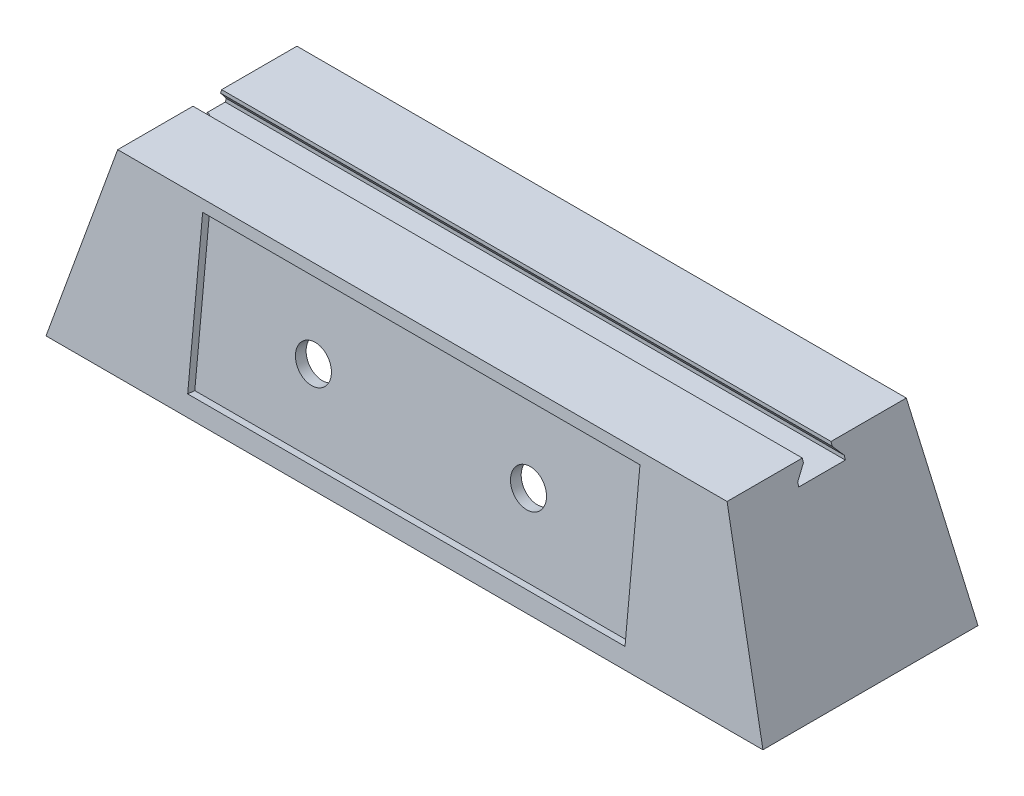
ISO-10303-21;
HEADER;
FILE_DESCRIPTION(('STEP AP214'),'2;1');
FILE_NAME('part.step','',(''),(''),'','','');
FILE_SCHEMA(('AUTOMOTIVE_DESIGN { 1 0 10303 214 1 1 1 1 }'));
ENDSEC;
DATA;
#1=APPLICATION_CONTEXT('core data for automotive mechanical design processes');
#2=APPLICATION_PROTOCOL_DEFINITION('international standard','automotive_design',2000,#1);
#3=PRODUCT_CONTEXT('',#1,'mechanical');
#4=PRODUCT('Part','Part','',(#3));
#5=PRODUCT_RELATED_PRODUCT_CATEGORY('part','',(#4));
#6=PRODUCT_DEFINITION_FORMATION('','',#4);
#7=PRODUCT_DEFINITION_CONTEXT('part definition',#1,'design');
#8=PRODUCT_DEFINITION('design','',#6,#7);
#9=PRODUCT_DEFINITION_SHAPE('','',#8);
#10=(LENGTH_UNIT() NAMED_UNIT(*) SI_UNIT(.MILLI.,.METRE.));
#11=(NAMED_UNIT(*) PLANE_ANGLE_UNIT() SI_UNIT($,.RADIAN.));
#12=(NAMED_UNIT(*) SI_UNIT($,.STERADIAN.) SOLID_ANGLE_UNIT());
#13=UNCERTAINTY_MEASURE_WITH_UNIT(LENGTH_MEASURE(1.E-05),#10,'distance_accuracy_value','');
#14=(GEOMETRIC_REPRESENTATION_CONTEXT(3) GLOBAL_UNCERTAINTY_ASSIGNED_CONTEXT((#13)) GLOBAL_UNIT_ASSIGNED_CONTEXT((#10,
#11,#12)) REPRESENTATION_CONTEXT('',''));
#15=CARTESIAN_POINT('',(0.,0.,0.));
#16=DIRECTION('',(0.,0.,1.));
#17=DIRECTION('',(1.,0.,0.));
#18=AXIS2_PLACEMENT_3D('',#15,#16,#17);
#19=CARTESIAN_POINT('',(-100.000000000004,0.,30.000000000001));
#20=DIRECTION('',(0.,0.0995037190210191,0.995037190209987));
#21=DIRECTION('',(1.,0.,0.));
#22=AXIS2_PLACEMENT_3D('',#19,#20,#21);
#23=PLANE('',#22);
#24=DIRECTION('',(1.,0.,0.));
#25=VECTOR('',#24,1.);
#26=CARTESIAN_POINT('',(-80.5000000000021,47.01488842937,25.298511157063));
#27=LINE('',#26,#25);
#28=CARTESIAN_POINT('',(-61.,47.01488842937,25.298511157063));
#29=VERTEX_POINT('',#28);
#30=CARTESIAN_POINT('',(61.,47.01488842937,25.298511157063));
#31=VERTEX_POINT('',#30);
#32=EDGE_CURVE('E412',#29,#31,#27,.T.);
#33=ORIENTED_EDGE('',*,*,#32,.T.);
#34=DIRECTION('',(0.,-0.995037190209987,0.0995037190210191));
#35=VECTOR('',#34,1.);
#36=CARTESIAN_POINT('',(61.,23.507444214685,27.649255578532));
#37=LINE('',#36,#35);
#38=CARTESIAN_POINT('',(61.,5.22332644055057,29.4776673559458));
#39=VERTEX_POINT('',#38);
#40=EDGE_CURVE('E357',#31,#39,#37,.T.);
#41=ORIENTED_EDGE('',*,*,#40,.T.);
#42=DIRECTION('',(-1.,0.,0.));
#43=VECTOR('',#42,1.);
#44=CARTESIAN_POINT('',(-19.5000000000021,5.22332644055057,29.4776673559459));
#45=LINE('',#44,#43);
#46=CARTESIAN_POINT('',(-61.,5.22332644055057,29.4776673559458));
#47=VERTEX_POINT('',#46);
#48=EDGE_CURVE('E440',#39,#47,#45,.T.);
#49=ORIENTED_EDGE('',*,*,#48,.T.);
#50=DIRECTION('',(0.,0.995037190209987,-0.0995037190210191));
#51=VECTOR('',#50,1.);
#52=CARTESIAN_POINT('',(-61.,2.61166322027529,29.7388336779734));
#53=LINE('',#52,#51);
#54=EDGE_CURVE('E430',#47,#29,#53,.T.);
#55=ORIENTED_EDGE('',*,*,#54,.T.);
#56=EDGE_LOOP('',(#33,#41,#49,#55));
#57=FACE_BOUND('',#56,.T.);
#58=DIRECTION('',(1.,0.,0.));
#59=VECTOR('',#58,1.);
#60=CARTESIAN_POINT('',(-100.000000000004,0.,30.000000000001));
#61=LINE('',#60,#59);
#62=CARTESIAN_POINT('',(-100.000000000004,0.,30.000000000001));
#63=VERTEX_POINT('',#62);
#64=CARTESIAN_POINT('',(99.9999999999959,0.,30.000000000001));
#65=VERTEX_POINT('',#64);
#66=EDGE_CURVE('E25',#63,#65,#61,.T.);
#67=ORIENTED_EDGE('',*,*,#66,.T.);
#68=DIRECTION('',(-0.286038776773604,0.953462589245612,-0.0953462589245808));
#69=VECTOR('',#68,1.);
#70=CARTESIAN_POINT('',(99.9999999999959,0.,30.000000000001));
#71=LINE('',#70,#69);
#72=CARTESIAN_POINT('',(85.,50.,25.));
#73=VERTEX_POINT('',#72);
#74=EDGE_CURVE('E271',#65,#73,#71,.T.);
#75=ORIENTED_EDGE('',*,*,#74,.T.);
#76=DIRECTION('',(1.,0.,0.));
#77=VECTOR('',#76,1.);
#78=CARTESIAN_POINT('',(-85.,50.,25.));
#79=LINE('',#78,#77);
#80=CARTESIAN_POINT('',(-85.,50.,25.));
#81=VERTEX_POINT('',#80);
#82=EDGE_CURVE('E264',#81,#73,#79,.T.);
#83=ORIENTED_EDGE('',*,*,#82,.F.);
#84=DIRECTION('',(0.286038776773751,0.953462589245569,-0.095346258924576));
#85=VECTOR('',#84,1.);
#86=CARTESIAN_POINT('',(-100.000000000004,0.,30.000000000001));
#87=LINE('',#86,#85);
#88=EDGE_CURVE('E724',#63,#81,#87,.T.);
#89=ORIENTED_EDGE('',*,*,#88,.F.);
#90=EDGE_LOOP('',(#67,#75,#83,#89));
#91=FACE_BOUND('',#90,.T.);
#92=ADVANCED_FACE('F16',(#57,#91),#23,.T.);
#93=CARTESIAN_POINT('',(99.9999999999958,0.,-29.999999999999));
#94=DIRECTION('',(0.,0.0995037190209786,-0.995037190209991));
#95=DIRECTION('',(-1.,0.,0.));
#96=AXIS2_PLACEMENT_3D('',#93,#94,#95);
#97=PLANE('',#96);
#98=DIRECTION('',(-1.,0.,0.));
#99=VECTOR('',#98,1.);
#100=CARTESIAN_POINT('',(99.9999999999958,0.,-29.999999999999));
#101=LINE('',#100,#99);
#102=CARTESIAN_POINT('',(99.9999999999958,0.,-29.999999999999));
#103=VERTEX_POINT('',#102);
#104=CARTESIAN_POINT('',(-100.000000000004,0.,-29.999999999999));
#105=VERTEX_POINT('',#104);
#106=EDGE_CURVE('E10',#103,#105,#101,.T.);
#107=ORIENTED_EDGE('',*,*,#106,.T.);
#108=DIRECTION('',(0.286038776773752,0.953462589245572,0.0953462589245374));
#109=VECTOR('',#108,1.);
#110=CARTESIAN_POINT('',(-100.000000000004,0.,-29.999999999999));
#111=LINE('',#110,#109);
#112=CARTESIAN_POINT('',(-85.,50.,-25.));
#113=VERTEX_POINT('',#112);
#114=EDGE_CURVE('E706',#105,#113,#111,.T.);
#115=ORIENTED_EDGE('',*,*,#114,.T.);
#116=DIRECTION('',(-1.,0.,0.));
#117=VECTOR('',#116,1.);
#118=CARTESIAN_POINT('',(85.,50.,-25.));
#119=LINE('',#118,#117);
#120=CARTESIAN_POINT('',(85.,50.,-25.));
#121=VERTEX_POINT('',#120);
#122=EDGE_CURVE('E40',#121,#113,#119,.T.);
#123=ORIENTED_EDGE('',*,*,#122,.F.);
#124=DIRECTION('',(-0.286038776773605,0.953462589245616,0.095346258924542));
#125=VECTOR('',#124,1.);
#126=CARTESIAN_POINT('',(99.9999999999958,0.,-29.999999999999));
#127=LINE('',#126,#125);
#128=EDGE_CURVE('E318',#103,#121,#127,.T.);
#129=ORIENTED_EDGE('',*,*,#128,.F.);
#130=EDGE_LOOP('',(#107,#115,#123,#129));
#131=FACE_BOUND('',#130,.T.);
#132=ADVANCED_FACE('F18',(#131),#97,.T.);
#133=CARTESIAN_POINT('',(-4.19182947871059E-12,0.,1.02806652080289E-12));
#134=DIRECTION('',(0.,1.,0.));
#135=DIRECTION('',(1.,0.,0.));
#136=AXIS2_PLACEMENT_3D('',#133,#134,#135);
#137=PLANE('',#136);
#138=DIRECTION('',(0.,0.,1.));
#139=VECTOR('',#138,1.);
#140=CARTESIAN_POINT('',(-96.867908047331,0.,-14.999999999999));
#141=LINE('',#140,#139);
#142=CARTESIAN_POINT('',(-96.8679080473309,0.,-26.9850373136627));
#143=VERTEX_POINT('',#142);
#144=CARTESIAN_POINT('',(-96.867908047331,0.,26.9850373136647));
#145=VERTEX_POINT('',#144);
#146=EDGE_CURVE('E399',#143,#145,#141,.T.);
#147=ORIENTED_EDGE('',*,*,#146,.T.);
#148=DIRECTION('',(1.,0.,0.));
#149=VECTOR('',#148,1.);
#150=CARTESIAN_POINT('',(-50.0000000000042,0.,26.9850373136647));
#151=LINE('',#150,#149);
#152=CARTESIAN_POINT('',(96.8679080473228,0.,26.9850373136647));
#153=VERTEX_POINT('',#152);
#154=EDGE_CURVE('E411',#145,#153,#151,.T.);
#155=ORIENTED_EDGE('',*,*,#154,.T.);
#156=DIRECTION('',(0.,0.,-1.));
#157=VECTOR('',#156,1.);
#158=CARTESIAN_POINT('',(96.8679080473228,0.,15.000000000001));
#159=LINE('',#158,#157);
#160=CARTESIAN_POINT('',(96.8679080473227,0.,-26.9850373136627));
#161=VERTEX_POINT('',#160);
#162=EDGE_CURVE('E383',#153,#161,#159,.T.);
#163=ORIENTED_EDGE('',*,*,#162,.T.);
#164=DIRECTION('',(-1.,0.,0.));
#165=VECTOR('',#164,1.);
#166=CARTESIAN_POINT('',(49.9999999999958,0.,-26.9850373136627));
#167=LINE('',#166,#165);
#168=EDGE_CURVE('E410',#161,#143,#167,.T.);
#169=ORIENTED_EDGE('',*,*,#168,.T.);
#170=EDGE_LOOP('',(#147,#155,#163,#169));
#171=FACE_BOUND('',#170,.T.);
#172=DIRECTION('',(0.,0.,-1.));
#173=VECTOR('',#172,1.);
#174=CARTESIAN_POINT('',(99.9999999999959,0.,30.000000000001));
#175=LINE('',#174,#173);
#176=EDGE_CURVE('E320',#65,#103,#175,.T.);
#177=ORIENTED_EDGE('',*,*,#176,.F.);
#178=ORIENTED_EDGE('',*,*,#66,.F.);
#179=DIRECTION('',(0.,0.,1.));
#180=VECTOR('',#179,1.);
#181=CARTESIAN_POINT('',(-100.000000000004,0.,-29.999999999999));
#182=LINE('',#181,#180);
#183=EDGE_CURVE('E709',#105,#63,#182,.T.);
#184=ORIENTED_EDGE('',*,*,#183,.F.);
#185=ORIENTED_EDGE('',*,*,#106,.F.);
#186=EDGE_LOOP('',(#177,#178,#184,#185));
#187=FACE_BOUND('',#186,.T.);
#188=ADVANCED_FACE('F885',(#171,#187),#137,.F.);
#189=CARTESIAN_POINT('',(0.,50.,0.));
#190=DIRECTION('',(0.,1.,0.));
#191=DIRECTION('',(1.,0.,0.));
#192=AXIS2_PLACEMENT_3D('',#189,#190,#191);
#193=PLANE('',#192);
#194=DIRECTION('',(1.,0.,0.));
#195=VECTOR('',#194,1.);
#196=CARTESIAN_POINT('',(0.,50.,-4.));
#197=LINE('',#196,#195);
#198=CARTESIAN_POINT('',(-85.,50.,-4.));
#199=VERTEX_POINT('',#198);
#200=CARTESIAN_POINT('',(85.,50.,-4.));
#201=VERTEX_POINT('',#200);
#202=EDGE_CURVE('E299',#199,#201,#197,.T.);
#203=ORIENTED_EDGE('',*,*,#202,.T.);
#204=DIRECTION('',(0.,0.,-1.));
#205=VECTOR('',#204,1.);
#206=CARTESIAN_POINT('',(85.,50.,25.));
#207=LINE('',#206,#205);
#208=EDGE_CURVE('E325',#201,#121,#207,.T.);
#209=ORIENTED_EDGE('',*,*,#208,.T.);
#210=ORIENTED_EDGE('',*,*,#122,.T.);
#211=DIRECTION('',(0.,0.,1.));
#212=VECTOR('',#211,1.);
#213=CARTESIAN_POINT('',(-85.,50.,-25.));
#214=LINE('',#213,#212);
#215=EDGE_CURVE('E693',#113,#199,#214,.T.);
#216=ORIENTED_EDGE('',*,*,#215,.T.);
#217=EDGE_LOOP('',(#203,#209,#210,#216));
#218=FACE_BOUND('',#217,.T.);
#219=ADVANCED_FACE('F886',(#218),#193,.T.);
#220=CARTESIAN_POINT('',(0.,50.,0.));
#221=DIRECTION('',(0.,1.,0.));
#222=DIRECTION('',(1.,0.,0.));
#223=AXIS2_PLACEMENT_3D('',#220,#221,#222);
#224=PLANE('',#223);
#225=DIRECTION('',(-1.,0.,0.));
#226=VECTOR('',#225,1.);
#227=CARTESIAN_POINT('',(0.,50.,4.));
#228=LINE('',#227,#226);
#229=CARTESIAN_POINT('',(85.,50.,4.));
#230=VERTEX_POINT('',#229);
#231=CARTESIAN_POINT('',(-85.,50.,4.));
#232=VERTEX_POINT('',#231);
#233=EDGE_CURVE('E263',#230,#232,#228,.T.);
#234=ORIENTED_EDGE('',*,*,#233,.T.);
#235=DIRECTION('',(0.,0.,1.));
#236=VECTOR('',#235,1.);
#237=CARTESIAN_POINT('',(-85.,50.,-25.));
#238=LINE('',#237,#236);
#239=EDGE_CURVE('E736',#232,#81,#238,.T.);
#240=ORIENTED_EDGE('',*,*,#239,.T.);
#241=ORIENTED_EDGE('',*,*,#82,.T.);
#242=DIRECTION('',(0.,0.,-1.));
#243=VECTOR('',#242,1.);
#244=CARTESIAN_POINT('',(85.,50.,25.));
#245=LINE('',#244,#243);
#246=EDGE_CURVE('E259',#73,#230,#245,.T.);
#247=ORIENTED_EDGE('',*,*,#246,.T.);
#248=EDGE_LOOP('',(#234,#240,#241,#247));
#249=FACE_BOUND('',#248,.T.);
#250=ADVANCED_FACE('F261',(#249),#224,.T.);
#251=CARTESIAN_POINT('',(99.9999999999959,0.,30.000000000001));
#252=DIRECTION('',(0.957826285221174,0.287347885566272,0.));
#253=DIRECTION('',(0.,0.,-1.));
#254=AXIS2_PLACEMENT_3D('',#251,#252,#253);
#255=PLANE('',#254);
#256=DIRECTION('',(0.287347885566272,-0.957826285221173,0.));
#257=VECTOR('',#256,1.);
#258=CARTESIAN_POINT('',(89.1284403669722,36.238532110089,-4.));
#259=LINE('',#258,#257);
#260=CARTESIAN_POINT('',(85.3,49.,-4.));
#261=VERTEX_POINT('',#260);
#262=EDGE_CURVE('E282',#201,#261,#259,.T.);
#263=ORIENTED_EDGE('',*,*,#262,.T.);
#264=DIRECTION('',(0.223974904925996,-0.746583016420198,-0.626457533721409));
#265=VECTOR('',#264,1.);
#266=CARTESIAN_POINT('',(85.6651781685994,47.7827394380014,-5.02140288861967));
#267=LINE('',#266,#265);
#268=CARTESIAN_POINT('',(86.1938151944453,46.0206160185145,-6.5));
#269=VERTEX_POINT('',#268);
#270=EDGE_CURVE('E306',#261,#269,#267,.T.);
#271=ORIENTED_EDGE('',*,*,#270,.T.);
#272=DIRECTION('',(0.287347885566272,-0.957826285221173,0.));
#273=VECTOR('',#272,1.);
#274=CARTESIAN_POINT('',(89.6788990825684,34.4036697247678,-6.5));
#275=LINE('',#274,#273);
#276=CARTESIAN_POINT('',(86.5,45.,-6.5));
#277=VERTEX_POINT('',#276);
#278=EDGE_CURVE('E275',#269,#277,#275,.T.);
#279=ORIENTED_EDGE('',*,*,#278,.T.);
#280=DIRECTION('',(0.,0.,1.));
#281=VECTOR('',#280,1.);
#282=CARTESIAN_POINT('',(86.5,45.,18.2500000000005));
#283=LINE('',#282,#281);
#284=CARTESIAN_POINT('',(86.5,45.,6.5));
#285=VERTEX_POINT('',#284);
#286=EDGE_CURVE('E386',#277,#285,#283,.T.);
#287=ORIENTED_EDGE('',*,*,#286,.T.);
#288=DIRECTION('',(-0.287347885566272,0.957826285221173,0.));
#289=VECTOR('',#288,1.);
#290=CARTESIAN_POINT('',(89.5384473369013,34.8718422103249,6.5));
#291=LINE('',#290,#289);
#292=CARTESIAN_POINT('',(86.1938151944454,46.0206160185145,6.5));
#293=VERTEX_POINT('',#292);
#294=EDGE_CURVE('E448',#285,#293,#291,.T.);
#295=ORIENTED_EDGE('',*,*,#294,.T.);
#296=DIRECTION('',(-0.223974904925997,0.746583016420198,-0.626457533721408));
#297=VECTOR('',#296,1.);
#298=CARTESIAN_POINT('',(89.450012579519,35.1666247349324,15.6075800828551));
#299=LINE('',#298,#297);
#300=CARTESIAN_POINT('',(85.3,49.,4.));
#301=VERTEX_POINT('',#300);
#302=EDGE_CURVE('E288',#293,#301,#299,.T.);
#303=ORIENTED_EDGE('',*,*,#302,.T.);
#304=DIRECTION('',(-0.287347885566272,0.957826285221173,0.));
#305=VECTOR('',#304,1.);
#306=CARTESIAN_POINT('',(88.9908256880731,36.6972477064193,4.));
#307=LINE('',#306,#305);
#308=EDGE_CURVE('E277',#301,#230,#307,.T.);
#309=ORIENTED_EDGE('',*,*,#308,.T.);
#310=ORIENTED_EDGE('',*,*,#246,.F.);
#311=ORIENTED_EDGE('',*,*,#74,.F.);
#312=ORIENTED_EDGE('',*,*,#176,.T.);
#313=ORIENTED_EDGE('',*,*,#128,.T.);
#314=ORIENTED_EDGE('',*,*,#208,.F.);
#315=EDGE_LOOP('',(#263,#271,#279,#287,#295,#303,#309,#310,#311,#312,#313,#314));
#316=FACE_BOUND('',#315,.T.);
#317=ADVANCED_FACE('F286',(#316),#255,.T.);
#318=CARTESIAN_POINT('',(0.,45.,-6.5));
#319=DIRECTION('',(0.,0.,-1.));
#320=DIRECTION('',(-1.,0.,0.));
#321=AXIS2_PLACEMENT_3D('',#318,#319,#320);
#322=PLANE('',#321);
#323=ORIENTED_EDGE('',*,*,#278,.F.);
#324=DIRECTION('',(1.,0.,0.));
#325=VECTOR('',#324,1.);
#326=CARTESIAN_POINT('',(0.,46.0206160185145,-6.5));
#327=LINE('',#326,#325);
#328=CARTESIAN_POINT('',(-86.193815194446,46.0206160185145,-6.5));
#329=VERTEX_POINT('',#328);
#330=EDGE_CURVE('E310',#329,#269,#327,.T.);
#331=ORIENTED_EDGE('',*,*,#330,.F.);
#332=DIRECTION('',(0.28734788556642,0.957826285221129,0.));
#333=VECTOR('',#332,1.);
#334=CARTESIAN_POINT('',(-89.6788990825692,34.4036697247735,-6.5));
#335=LINE('',#334,#333);
#336=CARTESIAN_POINT('',(-86.5,45.,-6.5));
#337=VERTEX_POINT('',#336);
#338=EDGE_CURVE('E705',#337,#329,#335,.T.);
#339=ORIENTED_EDGE('',*,*,#338,.F.);
#340=DIRECTION('',(1.,0.,0.));
#341=VECTOR('',#340,1.);
#342=CARTESIAN_POINT('',(0.,45.,-6.5));
#343=LINE('',#342,#341);
#344=EDGE_CURVE('E394',#337,#277,#343,.T.);
#345=ORIENTED_EDGE('',*,*,#344,.T.);
#346=EDGE_LOOP('',(#323,#331,#339,#345));
#347=FACE_BOUND('',#346,.T.);
#348=ADVANCED_FACE('F915',(#347),#322,.F.);
#349=CARTESIAN_POINT('',(0.,46.0206160185145,-6.5));
#350=DIRECTION('',(0.,0.642787609686539,-0.766044443118978));
#351=DIRECTION('',(-1.,0.,0.));
#352=AXIS2_PLACEMENT_3D('',#349,#350,#351);
#353=PLANE('',#352);
#354=ORIENTED_EDGE('',*,*,#270,.F.);
#355=DIRECTION('',(1.,0.,0.));
#356=VECTOR('',#355,1.);
#357=CARTESIAN_POINT('',(0.,49.,-4.));
#358=LINE('',#357,#356);
#359=CARTESIAN_POINT('',(-85.3,49.,-4.));
#360=VERTEX_POINT('',#359);
#361=EDGE_CURVE('E302',#360,#261,#358,.T.);
#362=ORIENTED_EDGE('',*,*,#361,.F.);
#363=DIRECTION('',(0.223974904926116,0.746583016420177,0.626457533721391));
#364=VECTOR('',#363,1.);
#365=CARTESIAN_POINT('',(-89.8745011652639,33.7516627824583,-16.794874135306));
#366=LINE('',#365,#364);
#367=EDGE_CURVE('E692',#329,#360,#366,.T.);
#368=ORIENTED_EDGE('',*,*,#367,.F.);
#369=ORIENTED_EDGE('',*,*,#330,.T.);
#370=EDGE_LOOP('',(#354,#362,#368,#369));
#371=FACE_BOUND('',#370,.T.);
#372=ADVANCED_FACE('F918',(#371),#353,.F.);
#373=CARTESIAN_POINT('',(0.,49.,-4.));
#374=DIRECTION('',(0.,0.,-1.));
#375=DIRECTION('',(0.,-1.,0.));
#376=AXIS2_PLACEMENT_3D('',#373,#374,#375);
#377=PLANE('',#376);
#378=ORIENTED_EDGE('',*,*,#262,.F.);
#379=ORIENTED_EDGE('',*,*,#202,.F.);
#380=DIRECTION('',(0.28734788556642,0.957826285221129,0.));
#381=VECTOR('',#380,1.);
#382=CARTESIAN_POINT('',(-89.1284403669728,36.2385321100945,-4.));
#383=LINE('',#382,#381);
#384=EDGE_CURVE('E686',#360,#199,#383,.T.);
#385=ORIENTED_EDGE('',*,*,#384,.F.);
#386=ORIENTED_EDGE('',*,*,#361,.T.);
#387=EDGE_LOOP('',(#378,#379,#385,#386));
#388=FACE_BOUND('',#387,.T.);
#389=ADVANCED_FACE('F888',(#388),#377,.F.);
#390=CARTESIAN_POINT('',(0.,50.,4.));
#391=DIRECTION('',(0.,0.,1.));
#392=DIRECTION('',(1.,0.,0.));
#393=AXIS2_PLACEMENT_3D('',#390,#391,#392);
#394=PLANE('',#393);
#395=ORIENTED_EDGE('',*,*,#308,.F.);
#396=DIRECTION('',(1.,0.,0.));
#397=VECTOR('',#396,1.);
#398=CARTESIAN_POINT('',(0.,49.,4.));
#399=LINE('',#398,#397);
#400=CARTESIAN_POINT('',(-85.3,49.,4.));
#401=VERTEX_POINT('',#400);
#402=EDGE_CURVE('E289',#401,#301,#399,.T.);
#403=ORIENTED_EDGE('',*,*,#402,.F.);
#404=DIRECTION('',(-0.28734788556642,-0.957826285221129,0.));
#405=VECTOR('',#404,1.);
#406=CARTESIAN_POINT('',(-88.9908256880737,36.6972477064248,4.));
#407=LINE('',#406,#405);
#408=EDGE_CURVE('E276',#232,#401,#407,.T.);
#409=ORIENTED_EDGE('',*,*,#408,.F.);
#410=ORIENTED_EDGE('',*,*,#233,.F.);
#411=EDGE_LOOP('',(#395,#403,#409,#410));
#412=FACE_BOUND('',#411,.T.);
#413=ADVANCED_FACE('F274',(#412),#394,.F.);
#414=CARTESIAN_POINT('',(0.,49.,4.));
#415=DIRECTION('',(0.,0.642787609686539,0.766044443118978));
#416=DIRECTION('',(1.,0.,0.));
#417=AXIS2_PLACEMENT_3D('',#414,#415,#416);
#418=PLANE('',#417);
#419=ORIENTED_EDGE('',*,*,#302,.F.);
#420=DIRECTION('',(1.,0.,0.));
#421=VECTOR('',#420,1.);
#422=CARTESIAN_POINT('',(0.,46.0206160185145,6.5));
#423=LINE('',#422,#421);
#424=CARTESIAN_POINT('',(-86.193815194446,46.0206160185145,6.5));
#425=VERTEX_POINT('',#424);
#426=EDGE_CURVE('E451',#425,#293,#423,.T.);
#427=ORIENTED_EDGE('',*,*,#426,.F.);
#428=DIRECTION('',(-0.223974904926116,-0.746583016420177,0.626457533721391));
#429=VECTOR('',#428,1.);
#430=CARTESIAN_POINT('',(-85.2406895828556,49.1977013904817,3.83410883616361));
#431=LINE('',#430,#429);
#432=EDGE_CURVE('E752',#401,#425,#431,.T.);
#433=ORIENTED_EDGE('',*,*,#432,.F.);
#434=ORIENTED_EDGE('',*,*,#402,.T.);
#435=EDGE_LOOP('',(#419,#427,#433,#434));
#436=FACE_BOUND('',#435,.T.);
#437=ADVANCED_FACE('F1016',(#436),#418,.F.);
#438=CARTESIAN_POINT('',(0.,46.0206160185145,6.5));
#439=DIRECTION('',(0.,0.,1.));
#440=DIRECTION('',(1.,0.,0.));
#441=AXIS2_PLACEMENT_3D('',#438,#439,#440);
#442=PLANE('',#441);
#443=ORIENTED_EDGE('',*,*,#294,.F.);
#444=DIRECTION('',(1.,0.,0.));
#445=VECTOR('',#444,1.);
#446=CARTESIAN_POINT('',(0.,45.,6.5));
#447=LINE('',#446,#445);
#448=CARTESIAN_POINT('',(-86.5,45.,6.5));
#449=VERTEX_POINT('',#448);
#450=EDGE_CURVE('E393',#449,#285,#447,.T.);
#451=ORIENTED_EDGE('',*,*,#450,.F.);
#452=DIRECTION('',(-0.28734788556642,-0.957826285221129,0.));
#453=VECTOR('',#452,1.);
#454=CARTESIAN_POINT('',(-89.5384473369021,34.8718422103306,6.5));
#455=LINE('',#454,#453);
#456=EDGE_CURVE('E772',#425,#449,#455,.T.);
#457=ORIENTED_EDGE('',*,*,#456,.F.);
#458=ORIENTED_EDGE('',*,*,#426,.T.);
#459=EDGE_LOOP('',(#443,#451,#457,#458));
#460=FACE_BOUND('',#459,.T.);
#461=ADVANCED_FACE('F909',(#460),#442,.F.);
#462=CARTESIAN_POINT('',(0.,45.,6.5));
#463=DIRECTION('',(0.,-1.,0.));
#464=DIRECTION('',(0.,0.,-1.));
#465=AXIS2_PLACEMENT_3D('',#462,#463,#464);
#466=PLANE('',#465);
#467=CARTESIAN_POINT('',(-86.5,45.,0.));
#468=DIRECTION('',(0.,-1.,0.));
#469=DIRECTION('',(0.,0.,-1.));
#470=AXIS2_PLACEMENT_3D('',#467,#468,#469);
#471=CIRCLE('',#470,1.50000127404969);
#472=CARTESIAN_POINT('',(-86.5,45.,-1.50000127404969));
#473=VERTEX_POINT('',#472);
#474=CARTESIAN_POINT('',(-86.5,45.,1.50000127404969));
#475=VERTEX_POINT('',#474);
#476=EDGE_CURVE('E803',#473,#475,#471,.T.);
#477=ORIENTED_EDGE('',*,*,#476,.T.);
#478=DIRECTION('',(0.,0.,-1.));
#479=VECTOR('',#478,1.);
#480=CARTESIAN_POINT('',(-86.5,45.,-11.7499999999995));
#481=LINE('',#480,#479);
#482=EDGE_CURVE('E473',#449,#475,#481,.T.);
#483=ORIENTED_EDGE('',*,*,#482,.F.);
#484=ORIENTED_EDGE('',*,*,#450,.T.);
#485=ORIENTED_EDGE('',*,*,#286,.F.);
#486=ORIENTED_EDGE('',*,*,#344,.F.);
#487=DIRECTION('',(0.,0.,-1.));
#488=VECTOR('',#487,1.);
#489=CARTESIAN_POINT('',(-86.5,45.,-11.7499999999995));
#490=LINE('',#489,#488);
#491=EDGE_CURVE('E700',#473,#337,#490,.T.);
#492=ORIENTED_EDGE('',*,*,#491,.F.);
#493=EDGE_LOOP('',(#477,#483,#484,#485,#486,#492));
#494=FACE_BOUND('',#493,.T.);
#495=ADVANCED_FACE('F804',(#494),#466,.F.);
#496=CARTESIAN_POINT('',(0.,25.9200999969183,25.3980148760845));
#497=DIRECTION('',(0.,-0.0995037190210191,-0.995037190209987));
#498=DIRECTION('',(0.,-0.995037190209987,0.0995037190210191));
#499=AXIS2_PLACEMENT_3D('',#496,#497,#498);
#500=PLANE('',#499);
#501=CARTESIAN_POINT('',(30.0000004470348,25.9200999969183,25.3980148760845));
#502=DIRECTION('',(0.,-0.0995037190210191,-0.995037190209987));
#503=DIRECTION('',(1.,0.,0.));
#504=AXIS2_PLACEMENT_3D('',#501,#502,#503);
#505=CIRCLE('',#504,5.);
#506=CARTESIAN_POINT('',(25.0000004470348,25.9200999969183,25.3980148760845));
#507=VERTEX_POINT('',#506);
#508=EDGE_CURVE('E831',#507,#507,#505,.T.);
#509=ORIENTED_EDGE('',*,*,#508,.T.);
#510=EDGE_LOOP('',(#509));
#511=FACE_BOUND('',#510,.T.);
#512=CARTESIAN_POINT('',(-29.9999995529652,25.9200999969183,25.3980148760845));
#513=DIRECTION('',(0.,-0.0995037190210191,-0.995037190209987));
#514=DIRECTION('',(1.,0.,0.));
#515=AXIS2_PLACEMENT_3D('',#512,#513,#514);
#516=CIRCLE('',#515,5.);
#517=CARTESIAN_POINT('',(-34.9999995529652,25.9200999969183,25.3980148760845));
#518=VERTEX_POINT('',#517);
#519=EDGE_CURVE('E818',#518,#518,#516,.T.);
#520=ORIENTED_EDGE('',*,*,#519,.T.);
#521=EDGE_LOOP('',(#520));
#522=FACE_BOUND('',#521,.T.);
#523=DIRECTION('',(0.,-0.995037190209987,0.0995037190210191));
#524=VECTOR('',#523,1.);
#525=CARTESIAN_POINT('',(61.,5.02431900250853,27.4875929755259));
#526=LINE('',#525,#524);
#527=CARTESIAN_POINT('',(61.,46.815880991328,23.3084367766431));
#528=VERTEX_POINT('',#527);
#529=CARTESIAN_POINT('',(61.,5.02431900250853,27.4875929755259));
#530=VERTEX_POINT('',#529);
#531=EDGE_CURVE('E362',#528,#530,#526,.T.);
#532=ORIENTED_EDGE('',*,*,#531,.F.);
#533=DIRECTION('',(1.,0.,0.));
#534=VECTOR('',#533,1.);
#535=CARTESIAN_POINT('',(61.,46.815880991328,23.3084367766431));
#536=LINE('',#535,#534);
#537=CARTESIAN_POINT('',(-61.,46.815880991328,23.3084367766431));
#538=VERTEX_POINT('',#537);
#539=EDGE_CURVE('E425',#538,#528,#536,.T.);
#540=ORIENTED_EDGE('',*,*,#539,.F.);
#541=DIRECTION('',(0.,0.995037190209987,-0.0995037190210191));
#542=VECTOR('',#541,1.);
#543=CARTESIAN_POINT('',(-61.,46.815880991328,23.3084367766431));
#544=LINE('',#543,#542);
#545=CARTESIAN_POINT('',(-61.,5.02431900250853,27.4875929755259));
#546=VERTEX_POINT('',#545);
#547=EDGE_CURVE('E432',#546,#538,#544,.T.);
#548=ORIENTED_EDGE('',*,*,#547,.F.);
#549=DIRECTION('',(-1.,0.,0.));
#550=VECTOR('',#549,1.);
#551=CARTESIAN_POINT('',(-61.,5.02431900250853,27.4875929755259));
#552=LINE('',#551,#550);
#553=EDGE_CURVE('E361',#530,#546,#552,.T.);
#554=ORIENTED_EDGE('',*,*,#553,.F.);
#555=EDGE_LOOP('',(#532,#540,#548,#554));
#556=FACE_BOUND('',#555,.T.);
#557=ADVANCED_FACE('F852',(#511,#522,#556),#500,.F.);
#558=CARTESIAN_POINT('',(61.,47.01488842937,25.298511157063));
#559=DIRECTION('',(1.,0.,0.));
#560=DIRECTION('',(0.,1.,0.));
#561=AXIS2_PLACEMENT_3D('',#558,#559,#560);
#562=PLANE('',#561);
#563=ORIENTED_EDGE('',*,*,#40,.F.);
#564=DIRECTION('',(0.,-0.0995037190210191,-0.995037190209987));
#565=VECTOR('',#564,1.);
#566=CARTESIAN_POINT('',(61.,47.01488842937,25.298511157063));
#567=LINE('',#566,#565);
#568=EDGE_CURVE('E426',#31,#528,#567,.T.);
#569=ORIENTED_EDGE('',*,*,#568,.T.);
#570=ORIENTED_EDGE('',*,*,#531,.T.);
#571=DIRECTION('',(0.,-0.0995037190210191,-0.995037190209987));
#572=VECTOR('',#571,1.);
#573=CARTESIAN_POINT('',(61.,5.22332644055057,29.4776673559458));
#574=LINE('',#573,#572);
#575=EDGE_CURVE('E439',#39,#530,#574,.T.);
#576=ORIENTED_EDGE('',*,*,#575,.F.);
#577=EDGE_LOOP('',(#563,#569,#570,#576));
#578=FACE_BOUND('',#577,.T.);
#579=ADVANCED_FACE('F857',(#578),#562,.F.);
#580=CARTESIAN_POINT('',(61.,5.22332644055057,29.4776673559458));
#581=DIRECTION('',(0.,-0.995037190209987,0.0995037190210191));
#582=DIRECTION('',(-1.,0.,0.));
#583=AXIS2_PLACEMENT_3D('',#580,#581,#582);
#584=PLANE('',#583);
#585=ORIENTED_EDGE('',*,*,#48,.F.);
#586=ORIENTED_EDGE('',*,*,#575,.T.);
#587=ORIENTED_EDGE('',*,*,#553,.T.);
#588=DIRECTION('',(0.,-0.0995037190210191,-0.995037190209987));
#589=VECTOR('',#588,1.);
#590=CARTESIAN_POINT('',(-61.,5.22332644055057,29.4776673559458));
#591=LINE('',#590,#589);
#592=EDGE_CURVE('E429',#47,#546,#591,.T.);
#593=ORIENTED_EDGE('',*,*,#592,.F.);
#594=EDGE_LOOP('',(#585,#586,#587,#593));
#595=FACE_BOUND('',#594,.T.);
#596=ADVANCED_FACE('F874',(#595),#584,.F.);
#597=CARTESIAN_POINT('',(-61.,5.22332644055057,29.4776673559458));
#598=DIRECTION('',(-1.,0.,0.));
#599=DIRECTION('',(0.,1.,0.));
#600=AXIS2_PLACEMENT_3D('',#597,#598,#599);
#601=PLANE('',#600);
#602=ORIENTED_EDGE('',*,*,#54,.F.);
#603=ORIENTED_EDGE('',*,*,#592,.T.);
#604=ORIENTED_EDGE('',*,*,#547,.T.);
#605=DIRECTION('',(0.,-0.0995037190210191,-0.995037190209987));
#606=VECTOR('',#605,1.);
#607=CARTESIAN_POINT('',(-61.,47.01488842937,25.298511157063));
#608=LINE('',#607,#606);
#609=EDGE_CURVE('E416',#29,#538,#608,.T.);
#610=ORIENTED_EDGE('',*,*,#609,.F.);
#611=EDGE_LOOP('',(#602,#603,#604,#610));
#612=FACE_BOUND('',#611,.T.);
#613=ADVANCED_FACE('F873',(#612),#601,.F.);
#614=CARTESIAN_POINT('',(-61.,47.01488842937,25.298511157063));
#615=DIRECTION('',(0.,0.995037190209987,-0.0995037190210191));
#616=DIRECTION('',(-1.,0.,0.));
#617=AXIS2_PLACEMENT_3D('',#614,#615,#616);
#618=PLANE('',#617);
#619=ORIENTED_EDGE('',*,*,#32,.F.);
#620=ORIENTED_EDGE('',*,*,#609,.T.);
#621=ORIENTED_EDGE('',*,*,#539,.T.);
#622=ORIENTED_EDGE('',*,*,#568,.F.);
#623=EDGE_LOOP('',(#619,#620,#621,#622));
#624=FACE_BOUND('',#623,.T.);
#625=ADVANCED_FACE('F867',(#624),#618,.F.);
#626=CARTESIAN_POINT('',(-100.000000000004,-0.298511157063057,27.014888429371));
#627=DIRECTION('',(0.,0.0995037190210191,0.995037190209987));
#628=DIRECTION('',(1.,0.,0.));
#629=AXIS2_PLACEMENT_3D('',#626,#627,#628);
#630=PLANE('',#629);
#631=DIRECTION('',(0.,0.995037190209987,-0.0995037190210191));
#632=VECTOR('',#631,1.);
#633=CARTESIAN_POINT('',(-64.,2.31315206321223,26.7537221073435));
#634=LINE('',#633,#632);
#635=CARTESIAN_POINT('',(-64.,1.93970371285755,26.7910669423789));
#636=VERTEX_POINT('',#635);
#637=CARTESIAN_POINT('',(-64.,47.,22.2850373136638));
#638=VERTEX_POINT('',#637);
#639=EDGE_CURVE('E567',#636,#638,#634,.T.);
#640=ORIENTED_EDGE('',*,*,#639,.F.);
#641=DIRECTION('',(-1.,0.,0.));
#642=VECTOR('',#641,1.);
#643=CARTESIAN_POINT('',(-19.5000000000021,1.93970371285755,26.7910669423789));
#644=LINE('',#643,#642);
#645=CARTESIAN_POINT('',(64.,1.93970371285755,26.791066942379));
#646=VERTEX_POINT('',#645);
#647=EDGE_CURVE('E337',#646,#636,#644,.T.);
#648=ORIENTED_EDGE('',*,*,#647,.F.);
#649=DIRECTION('',(0.,-0.995037190209987,0.0995037190210191));
#650=VECTOR('',#649,1.);
#651=CARTESIAN_POINT('',(64.,23.208933057622,24.6641440079021));
#652=LINE('',#651,#650);
#653=CARTESIAN_POINT('',(64.,47.,22.2850373136638));
#654=VERTEX_POINT('',#653);
#655=EDGE_CURVE('E350',#654,#646,#652,.T.);
#656=ORIENTED_EDGE('',*,*,#655,.F.);
#657=DIRECTION('',(1.,0.,0.));
#658=VECTOR('',#657,1.);
#659=CARTESIAN_POINT('',(-50.0000000000021,47.,22.2850373136638));
#660=LINE('',#659,#658);
#661=CARTESIAN_POINT('',(82.7679080473267,47.,22.2850373136638));
#662=VERTEX_POINT('',#661);
#663=EDGE_CURVE('E516',#654,#662,#660,.T.);
#664=ORIENTED_EDGE('',*,*,#663,.T.);
#665=DIRECTION('',(-0.286038776773604,0.953462589245612,-0.0953462589245808));
#666=VECTOR('',#665,1.);
#667=CARTESIAN_POINT('',(89.0245781894457,26.1444328595977,24.3705940277044));
#668=LINE('',#667,#666);
#669=EDGE_CURVE('E389',#153,#662,#668,.T.);
#670=ORIENTED_EDGE('',*,*,#669,.F.);
#671=ORIENTED_EDGE('',*,*,#154,.F.);
#672=DIRECTION('',(0.286038776773751,0.953462589245569,-0.0953462589245763));
#673=VECTOR('',#672,1.);
#674=CARTESIAN_POINT('',(-96.388214553086,1.59897831414964,26.8251394822497));
#675=LINE('',#674,#673);
#676=CARTESIAN_POINT('',(-82.767908047327,47.,22.2850373136638));
#677=VERTEX_POINT('',#676);
#678=EDGE_CURVE('E400',#145,#677,#675,.T.);
#679=ORIENTED_EDGE('',*,*,#678,.T.);
#680=DIRECTION('',(1.,0.,0.));
#681=VECTOR('',#680,1.);
#682=CARTESIAN_POINT('',(-50.0000000000021,47.,22.2850373136638));
#683=LINE('',#682,#681);
#684=EDGE_CURVE('E542',#677,#638,#683,.T.);
#685=ORIENTED_EDGE('',*,*,#684,.T.);
#686=EDGE_LOOP('',(#640,#648,#656,#664,#670,#671,#679,#685));
#687=FACE_BOUND('',#686,.T.);
#688=ADVANCED_FACE('F948',(#687),#630,.F.);
#689=CARTESIAN_POINT('',(99.9999999999958,-0.298511157062936,-27.014888429369));
#690=DIRECTION('',(0.,0.0995037190209786,-0.995037190209991));
#691=DIRECTION('',(-1.,0.,0.));
#692=AXIS2_PLACEMENT_3D('',#689,#690,#691);
#693=PLANE('',#692);
#694=ORIENTED_EDGE('',*,*,#168,.F.);
#695=DIRECTION('',(-0.286038776773605,0.953462589245616,0.0953462589245419));
#696=VECTOR('',#695,1.);
#697=CARTESIAN_POINT('',(96.3882145530781,1.59897831414931,-26.8251394822478));
#698=LINE('',#697,#696);
#699=CARTESIAN_POINT('',(82.7679080473267,47.,-22.2850373136637));
#700=VERTEX_POINT('',#699);
#701=EDGE_CURVE('E381',#161,#700,#698,.T.);
#702=ORIENTED_EDGE('',*,*,#701,.T.);
#703=DIRECTION('',(-1.,0.,0.));
#704=VECTOR('',#703,1.);
#705=CARTESIAN_POINT('',(49.9999999999979,47.,-22.2850373136637));
#706=LINE('',#705,#704);
#707=CARTESIAN_POINT('',(-82.767908047327,47.,-22.2850373136637));
#708=VERTEX_POINT('',#707);
#709=EDGE_CURVE('E492',#700,#708,#706,.T.);
#710=ORIENTED_EDGE('',*,*,#709,.T.);
#711=DIRECTION('',(0.286038776773752,0.953462589245572,0.0953462589245375));
#712=VECTOR('',#711,1.);
#713=CARTESIAN_POINT('',(-89.0245781894456,26.1444328596104,-24.3705940277022));
#714=LINE('',#713,#712);
#715=EDGE_CURVE('E402',#143,#708,#714,.T.);
#716=ORIENTED_EDGE('',*,*,#715,.F.);
#717=EDGE_LOOP('',(#694,#702,#710,#716));
#718=FACE_BOUND('',#717,.T.);
#719=ADVANCED_FACE('F957',(#718),#693,.F.);
#720=CARTESIAN_POINT('',(-97.1265211443408,-0.862043656699259,-29.999999999999));
#721=DIRECTION('',(-0.957826285221129,0.28734788556642,0.));
#722=DIRECTION('',(0.,0.,1.));
#723=AXIS2_PLACEMENT_3D('',#720,#721,#722);
#724=PLANE('',#723);
#725=DIRECTION('',(0.28734788556642,0.957826285221129,0.));
#726=VECTOR('',#725,1.);
#727=CARTESIAN_POINT('',(-86.8054202269059,33.5416260680742,-9.5));
#728=LINE('',#727,#726);
#729=CARTESIAN_POINT('',(-84.2679080473274,42.,-9.5));
#730=VERTEX_POINT('',#729);
#731=CARTESIAN_POINT('',(-82.767908047327,47.,-9.5));
#732=VERTEX_POINT('',#731);
#733=EDGE_CURVE('E378',#730,#732,#728,.T.);
#734=ORIENTED_EDGE('',*,*,#733,.F.);
#735=DIRECTION('',(0.,0.,-1.));
#736=VECTOR('',#735,1.);
#737=CARTESIAN_POINT('',(-84.2679080473274,42.,-11.7499999999995));
#738=LINE('',#737,#736);
#739=CARTESIAN_POINT('',(-84.2679080473274,42.,9.5));
#740=VERTEX_POINT('',#739);
#741=EDGE_CURVE('E358',#740,#730,#738,.T.);
#742=ORIENTED_EDGE('',*,*,#741,.F.);
#743=DIRECTION('',(-0.28734788556642,-0.957826285221129,0.));
#744=VECTOR('',#743,1.);
#745=CARTESIAN_POINT('',(-86.6649684812387,34.0097985536313,9.5));
#746=LINE('',#745,#744);
#747=CARTESIAN_POINT('',(-82.767908047327,47.,9.5));
#748=VERTEX_POINT('',#747);
#749=EDGE_CURVE('E371',#748,#740,#746,.T.);
#750=ORIENTED_EDGE('',*,*,#749,.F.);
#751=DIRECTION('',(0.,0.,1.));
#752=VECTOR('',#751,1.);
#753=CARTESIAN_POINT('',(-82.767908047327,47.,-14.9999999999995));
#754=LINE('',#753,#752);
#755=EDGE_CURVE('E552',#748,#677,#754,.T.);
#756=ORIENTED_EDGE('',*,*,#755,.T.);
#757=ORIENTED_EDGE('',*,*,#678,.F.);
#758=ORIENTED_EDGE('',*,*,#146,.F.);
#759=ORIENTED_EDGE('',*,*,#715,.T.);
#760=DIRECTION('',(0.,0.,1.));
#761=VECTOR('',#760,1.);
#762=CARTESIAN_POINT('',(-82.767908047327,47.,-14.9999999999995));
#763=LINE('',#762,#761);
#764=EDGE_CURVE('E477',#708,#732,#763,.T.);
#765=ORIENTED_EDGE('',*,*,#764,.T.);
#766=EDGE_LOOP('',(#734,#742,#750,#756,#757,#758,#759,#765));
#767=FACE_BOUND('',#766,.T.);
#768=ADVANCED_FACE('F944',(#767),#724,.F.);
#769=CARTESIAN_POINT('',(97.1265211443323,-0.862043656698815,30.000000000001));
#770=DIRECTION('',(0.957826285221174,0.287347885566272,0.));
#771=DIRECTION('',(0.,0.,-1.));
#772=AXIS2_PLACEMENT_3D('',#769,#770,#771);
#773=PLANE('',#772);
#774=DIRECTION('',(-0.287347885566272,0.957826285221173,0.));
#775=VECTOR('',#774,1.);
#776=CARTESIAN_POINT('',(86.6649684812378,34.0097985536261,9.5));
#777=LINE('',#776,#775);
#778=CARTESIAN_POINT('',(84.2679080473263,42.,9.5));
#779=VERTEX_POINT('',#778);
#780=CARTESIAN_POINT('',(82.7679080473267,47.,9.5));
#781=VERTEX_POINT('',#780);
#782=EDGE_CURVE('E372',#779,#781,#777,.T.);
#783=ORIENTED_EDGE('',*,*,#782,.F.);
#784=DIRECTION('',(0.,0.,1.));
#785=VECTOR('',#784,1.);
#786=CARTESIAN_POINT('',(84.2679080473263,42.,18.2500000000005));
#787=LINE('',#786,#785);
#788=CARTESIAN_POINT('',(84.2679080473263,42.,-9.5));
#789=VERTEX_POINT('',#788);
#790=EDGE_CURVE('E349',#789,#779,#787,.T.);
#791=ORIENTED_EDGE('',*,*,#790,.F.);
#792=DIRECTION('',(0.287347885566272,-0.957826285221173,0.));
#793=VECTOR('',#792,1.);
#794=CARTESIAN_POINT('',(86.8054202269048,33.541626068069,-9.5));
#795=LINE('',#794,#793);
#796=CARTESIAN_POINT('',(82.7679080473267,47.,-9.5));
#797=VERTEX_POINT('',#796);
#798=EDGE_CURVE('E374',#797,#789,#795,.T.);
#799=ORIENTED_EDGE('',*,*,#798,.F.);
#800=DIRECTION('',(0.,0.,-1.));
#801=VECTOR('',#800,1.);
#802=CARTESIAN_POINT('',(82.7679080473267,47.,15.0000000000005));
#803=LINE('',#802,#801);
#804=EDGE_CURVE('E498',#797,#700,#803,.T.);
#805=ORIENTED_EDGE('',*,*,#804,.T.);
#806=ORIENTED_EDGE('',*,*,#701,.F.);
#807=ORIENTED_EDGE('',*,*,#162,.F.);
#808=ORIENTED_EDGE('',*,*,#669,.T.);
#809=DIRECTION('',(0.,0.,-1.));
#810=VECTOR('',#809,1.);
#811=CARTESIAN_POINT('',(82.7679080473267,47.,15.0000000000005));
#812=LINE('',#811,#810);
#813=EDGE_CURVE('E515',#662,#781,#812,.T.);
#814=ORIENTED_EDGE('',*,*,#813,.T.);
#815=EDGE_LOOP('',(#783,#791,#799,#805,#806,#807,#808,#814));
#816=FACE_BOUND('',#815,.T.);
#817=ADVANCED_FACE('F952',(#816),#773,.F.);
#818=CARTESIAN_POINT('',(0.,45.,-9.5));
#819=DIRECTION('',(0.,0.,-1.));
#820=DIRECTION('',(-1.,0.,0.));
#821=AXIS2_PLACEMENT_3D('',#818,#819,#820);
#822=PLANE('',#821);
#823=DIRECTION('',(-1.,0.,0.));
#824=VECTOR('',#823,1.);
#825=CARTESIAN_POINT('',(0.,47.,-9.5));
#826=LINE('',#825,#824);
#827=EDGE_CURVE('E474',#797,#732,#826,.T.);
#828=ORIENTED_EDGE('',*,*,#827,.F.);
#829=ORIENTED_EDGE('',*,*,#798,.T.);
#830=DIRECTION('',(1.,0.,0.));
#831=VECTOR('',#830,1.);
#832=CARTESIAN_POINT('',(0.,42.,-9.5));
#833=LINE('',#832,#831);
#834=EDGE_CURVE('E370',#730,#789,#833,.T.);
#835=ORIENTED_EDGE('',*,*,#834,.F.);
#836=ORIENTED_EDGE('',*,*,#733,.T.);
#837=EDGE_LOOP('',(#828,#829,#835,#836));
#838=FACE_BOUND('',#837,.T.);
#839=ADVANCED_FACE('F968',(#838),#822,.T.);
#840=CARTESIAN_POINT('',(0.,46.0206160185145,9.5));
#841=DIRECTION('',(0.,0.,1.));
#842=DIRECTION('',(1.,0.,0.));
#843=AXIS2_PLACEMENT_3D('',#840,#841,#842);
#844=PLANE('',#843);
#845=DIRECTION('',(1.,0.,0.));
#846=VECTOR('',#845,1.);
#847=CARTESIAN_POINT('',(0.,47.,9.5));
#848=LINE('',#847,#846);
#849=EDGE_CURVE('E510',#748,#781,#848,.T.);
#850=ORIENTED_EDGE('',*,*,#849,.F.);
#851=ORIENTED_EDGE('',*,*,#749,.T.);
#852=DIRECTION('',(1.,0.,0.));
#853=VECTOR('',#852,1.);
#854=CARTESIAN_POINT('',(0.,42.,9.5));
#855=LINE('',#854,#853);
#856=EDGE_CURVE('E353',#740,#779,#855,.T.);
#857=ORIENTED_EDGE('',*,*,#856,.T.);
#858=ORIENTED_EDGE('',*,*,#782,.T.);
#859=EDGE_LOOP('',(#850,#851,#857,#858));
#860=FACE_BOUND('',#859,.T.);
#861=ADVANCED_FACE('F972',(#860),#844,.T.);
#862=CARTESIAN_POINT('',(0.,42.,6.5));
#863=DIRECTION('',(0.,-1.,0.));
#864=DIRECTION('',(0.,0.,-1.));
#865=AXIS2_PLACEMENT_3D('',#862,#863,#864);
#866=PLANE('',#865);
#867=ORIENTED_EDGE('',*,*,#790,.T.);
#868=ORIENTED_EDGE('',*,*,#856,.F.);
#869=ORIENTED_EDGE('',*,*,#741,.T.);
#870=ORIENTED_EDGE('',*,*,#834,.T.);
#871=EDGE_LOOP('',(#867,#868,#869,#870));
#872=FACE_BOUND('',#871,.T.);
#873=ADVANCED_FACE('F969',(#872),#866,.T.);
#874=CARTESIAN_POINT('',(0.,25.6215888398552,22.4129033054545));
#875=DIRECTION('',(0.,-0.0995037190210191,-0.995037190209987));
#876=DIRECTION('',(0.,-0.995037190209987,0.0995037190210191));
#877=AXIS2_PLACEMENT_3D('',#874,#875,#876);
#878=PLANE('',#877);
#879=CARTESIAN_POINT('',(30.0000004470348,25.6215888398552,22.4129033054545));
#880=DIRECTION('',(0.,0.0995037190210191,0.995037190209987));
#881=DIRECTION('',(1.,0.,0.));
#882=AXIS2_PLACEMENT_3D('',#879,#880,#881);
#883=CIRCLE('',#882,5.);
#884=CARTESIAN_POINT('',(25.0000004470348,25.6215888398552,22.4129033054545));
#885=VERTEX_POINT('',#884);
#886=EDGE_CURVE('E806',#885,#885,#883,.T.);
#887=ORIENTED_EDGE('',*,*,#886,.T.);
#888=EDGE_LOOP('',(#887));
#889=FACE_BOUND('',#888,.T.);
#890=CARTESIAN_POINT('',(-29.9999995529652,25.6215888398552,22.4129033054545));
#891=DIRECTION('',(0.,0.0995037190210191,0.995037190209987));
#892=DIRECTION('',(1.,0.,0.));
#893=AXIS2_PLACEMENT_3D('',#890,#891,#892);
#894=CIRCLE('',#893,5.);
#895=CARTESIAN_POINT('',(-34.9999995529652,25.6215888398552,22.4129033054545));
#896=VERTEX_POINT('',#895);
#897=EDGE_CURVE('E827',#896,#896,#894,.T.);
#898=ORIENTED_EDGE('',*,*,#897,.T.);
#899=EDGE_LOOP('',(#898));
#900=FACE_BOUND('',#899,.T.);
#901=DIRECTION('',(-1.,0.,0.));
#902=VECTOR('',#901,1.);
#903=CARTESIAN_POINT('',(0.,47.,20.2750621894396));
#904=LINE('',#903,#902);
#905=CARTESIAN_POINT('',(64.,47.,20.2750621894396));
#906=VERTEX_POINT('',#905);
#907=CARTESIAN_POINT('',(-64.,47.,20.2750621894396));
#908=VERTEX_POINT('',#907);
#909=EDGE_CURVE('E529',#906,#908,#904,.T.);
#910=ORIENTED_EDGE('',*,*,#909,.F.);
#911=DIRECTION('',(0.,-0.995037190209987,0.0995037190210191));
#912=VECTOR('',#911,1.);
#913=CARTESIAN_POINT('',(64.,36.0694793370601,21.3681142557338));
#914=LINE('',#913,#912);
#915=CARTESIAN_POINT('',(64.,1.74069627481551,24.800992561959));
#916=VERTEX_POINT('',#915);
#917=EDGE_CURVE('E346',#906,#916,#914,.T.);
#918=ORIENTED_EDGE('',*,*,#917,.T.);
#919=DIRECTION('',(-1.,0.,0.));
#920=VECTOR('',#919,1.);
#921=CARTESIAN_POINT('',(30.5,1.74069627481551,24.800992561959));
#922=LINE('',#921,#920);
#923=CARTESIAN_POINT('',(-64.,1.74069627481551,24.800992561959));
#924=VERTEX_POINT('',#923);
#925=EDGE_CURVE('E338',#916,#924,#922,.T.);
#926=ORIENTED_EDGE('',*,*,#925,.T.);
#927=DIRECTION('',(0.,0.995037190209987,-0.0995037190210191));
#928=VECTOR('',#927,1.);
#929=CARTESIAN_POINT('',(-64.,15.1736983426503,23.4576923551752));
#930=LINE('',#929,#928);
#931=EDGE_CURVE('E559',#924,#908,#930,.T.);
#932=ORIENTED_EDGE('',*,*,#931,.T.);
#933=EDGE_LOOP('',(#910,#918,#926,#932));
#934=FACE_BOUND('',#933,.T.);
#935=ADVANCED_FACE('F983',(#889,#900,#934),#878,.T.);
#936=CARTESIAN_POINT('',(64.,47.01488842937,25.298511157063));
#937=DIRECTION('',(1.,0.,0.));
#938=DIRECTION('',(0.,1.,0.));
#939=AXIS2_PLACEMENT_3D('',#936,#937,#938);
#940=PLANE('',#939);
#941=DIRECTION('',(0.,0.,-1.));
#942=VECTOR('',#941,1.);
#943=CARTESIAN_POINT('',(64.,47.,12.6492555785315));
#944=LINE('',#943,#942);
#945=EDGE_CURVE('E523',#654,#906,#944,.T.);
#946=ORIENTED_EDGE('',*,*,#945,.F.);
#947=ORIENTED_EDGE('',*,*,#655,.T.);
#948=DIRECTION('',(0.,-0.0995037190210191,-0.995037190209987));
#949=VECTOR('',#948,1.);
#950=CARTESIAN_POINT('',(64.,2.2382148699206,29.7761785130089));
#951=LINE('',#950,#949);
#952=EDGE_CURVE('E345',#646,#916,#951,.T.);
#953=ORIENTED_EDGE('',*,*,#952,.T.);
#954=ORIENTED_EDGE('',*,*,#917,.F.);
#955=EDGE_LOOP('',(#946,#947,#953,#954));
#956=FACE_BOUND('',#955,.T.);
#957=ADVANCED_FACE('F977',(#956),#940,.T.);
#958=CARTESIAN_POINT('',(61.,2.2382148699206,29.7761785130089));
#959=DIRECTION('',(0.,-0.995037190209987,0.0995037190210191));
#960=DIRECTION('',(-1.,0.,0.));
#961=AXIS2_PLACEMENT_3D('',#958,#959,#960);
#962=PLANE('',#961);
#963=ORIENTED_EDGE('',*,*,#647,.T.);
#964=DIRECTION('',(0.,-0.0995037190210191,-0.995037190209987));
#965=VECTOR('',#964,1.);
#966=CARTESIAN_POINT('',(-64.,2.23821486992061,29.7761785130089));
#967=LINE('',#966,#965);
#968=EDGE_CURVE('E562',#636,#924,#967,.T.);
#969=ORIENTED_EDGE('',*,*,#968,.T.);
#970=ORIENTED_EDGE('',*,*,#925,.F.);
#971=ORIENTED_EDGE('',*,*,#952,.F.);
#972=EDGE_LOOP('',(#963,#969,#970,#971));
#973=FACE_BOUND('',#972,.T.);
#974=ADVANCED_FACE('F992',(#973),#962,.T.);
#975=CARTESIAN_POINT('',(-64.,5.22332644055057,29.4776673559458));
#976=DIRECTION('',(-1.,0.,0.));
#977=DIRECTION('',(0.,1.,0.));
#978=AXIS2_PLACEMENT_3D('',#975,#976,#977);
#979=PLANE('',#978);
#980=DIRECTION('',(0.,0.,1.));
#981=VECTOR('',#980,1.);
#982=CARTESIAN_POINT('',(-64.,47.,14.7388336779729));
#983=LINE('',#982,#981);
#984=EDGE_CURVE('E540',#908,#638,#983,.T.);
#985=ORIENTED_EDGE('',*,*,#984,.F.);
#986=ORIENTED_EDGE('',*,*,#931,.F.);
#987=ORIENTED_EDGE('',*,*,#968,.F.);
#988=ORIENTED_EDGE('',*,*,#639,.T.);
#989=EDGE_LOOP('',(#985,#986,#987,#988));
#990=FACE_BOUND('',#989,.T.);
#991=ADVANCED_FACE('F987',(#990),#979,.T.);
#992=CARTESIAN_POINT('',(0.,47.,0.));
#993=DIRECTION('',(0.,1.,0.));
#994=DIRECTION('',(1.,0.,0.));
#995=AXIS2_PLACEMENT_3D('',#992,#993,#994);
#996=PLANE('',#995);
#997=ORIENTED_EDGE('',*,*,#849,.T.);
#998=ORIENTED_EDGE('',*,*,#813,.F.);
#999=ORIENTED_EDGE('',*,*,#663,.F.);
#1000=ORIENTED_EDGE('',*,*,#945,.T.);
#1001=ORIENTED_EDGE('',*,*,#909,.T.);
#1002=ORIENTED_EDGE('',*,*,#984,.T.);
#1003=ORIENTED_EDGE('',*,*,#684,.F.);
#1004=ORIENTED_EDGE('',*,*,#755,.F.);
#1005=EDGE_LOOP('',(#997,#998,#999,#1000,#1001,#1002,#1003,#1004));
#1006=FACE_BOUND('',#1005,.T.);
#1007=ADVANCED_FACE('F974',(#1006),#996,.F.);
#1008=CARTESIAN_POINT('',(0.,47.,0.));
#1009=DIRECTION('',(0.,1.,0.));
#1010=DIRECTION('',(1.,0.,0.));
#1011=AXIS2_PLACEMENT_3D('',#1008,#1009,#1010);
#1012=PLANE('',#1011);
#1013=ORIENTED_EDGE('',*,*,#827,.T.);
#1014=ORIENTED_EDGE('',*,*,#764,.F.);
#1015=ORIENTED_EDGE('',*,*,#709,.F.);
#1016=ORIENTED_EDGE('',*,*,#804,.F.);
#1017=EDGE_LOOP('',(#1013,#1014,#1015,#1016));
#1018=FACE_BOUND('',#1017,.T.);
#1019=ADVANCED_FACE('F962',(#1018),#1012,.F.);
#1020=CARTESIAN_POINT('',(-100.000000000004,0.,-29.999999999999));
#1021=DIRECTION('',(-0.957826285221129,0.28734788556642,0.));
#1022=DIRECTION('',(0.,0.,1.));
#1023=AXIS2_PLACEMENT_3D('',#1020,#1021,#1022);
#1024=PLANE('',#1023);
#1025=CARTESIAN_POINT('',(-86.5,45.,0.));
#1026=DIRECTION('',(0.957826285221129,-0.28734788556642,0.));
#1027=DIRECTION('',(0.,0.,-1.));
#1028=AXIS2_PLACEMENT_3D('',#1025,#1026,#1027);
#1029=CIRCLE('',#1028,1.50000127404969);
#1030=EDGE_CURVE('E793',#475,#473,#1029,.T.);
#1031=ORIENTED_EDGE('',*,*,#1030,.T.);
#1032=ORIENTED_EDGE('',*,*,#491,.T.);
#1033=ORIENTED_EDGE('',*,*,#338,.T.);
#1034=ORIENTED_EDGE('',*,*,#367,.T.);
#1035=ORIENTED_EDGE('',*,*,#384,.T.);
#1036=ORIENTED_EDGE('',*,*,#215,.F.);
#1037=ORIENTED_EDGE('',*,*,#114,.F.);
#1038=ORIENTED_EDGE('',*,*,#183,.T.);
#1039=ORIENTED_EDGE('',*,*,#88,.T.);
#1040=ORIENTED_EDGE('',*,*,#239,.F.);
#1041=ORIENTED_EDGE('',*,*,#408,.T.);
#1042=ORIENTED_EDGE('',*,*,#432,.T.);
#1043=ORIENTED_EDGE('',*,*,#456,.T.);
#1044=ORIENTED_EDGE('',*,*,#482,.T.);
#1045=EDGE_LOOP('',(#1031,#1032,#1033,#1034,#1035,#1036,#1037,#1038,#1039,#1040,#1041,#1042,
#1043,#1044));
#1046=FACE_BOUND('',#1045,.T.);
#1047=ADVANCED_FACE('F795',(#1046),#1024,.T.);
#1048=CARTESIAN_POINT('',(-86.5,45.,0.));
#1049=DIRECTION('',(0.,1.,0.));
#1050=DIRECTION('',(0.,0.,-1.));
#1051=AXIS2_PLACEMENT_3D('',#1048,#1049,#1050);
#1052=SPHERICAL_SURFACE('',#1051,1.50000127404969);
#1053=ORIENTED_EDGE('',*,*,#476,.F.);
#1054=ORIENTED_EDGE('',*,*,#1030,.F.);
#1055=CARTESIAN_POINT('',(-86.5,45.,0.));
#1056=DIRECTION('',(-1.,0.,0.));
#1057=DIRECTION('',(0.,0.,1.));
#1058=AXIS2_PLACEMENT_3D('',#1055,#1056,#1057);
#1059=CIRCLE('',#1058,1.50000127404969);
#1060=CARTESIAN_POINT('',(-86.5,43.4999987259503,0.));
#1061=VERTEX_POINT('',#1060);
#1062=EDGE_CURVE('E676',#1061,#475,#1059,.T.);
#1063=ORIENTED_EDGE('',*,*,#1062,.F.);
#1064=ORIENTED_EDGE('',*,*,#1062,.T.);
#1065=EDGE_LOOP('',(#1053,#1054,#1063,#1064));
#1066=FACE_BOUND('',#1065,.T.);
#1067=ADVANCED_FACE('F799',(#1066),#1052,.F.);
#1068=CARTESIAN_POINT('',(30.0000004470348,25.9200999969183,25.3980148760845));
#1069=DIRECTION('',(0.,-0.0995037190210191,-0.995037190209987));
#1070=DIRECTION('',(1.,0.,0.));
#1071=AXIS2_PLACEMENT_3D('',#1068,#1069,#1070);
#1072=CYLINDRICAL_SURFACE('',#1071,5.);
#1073=ORIENTED_EDGE('',*,*,#508,.F.);
#1074=DIRECTION('',(0.,-0.0995037190210191,-0.995037190209987));
#1075=VECTOR('',#1074,1.);
#1076=CARTESIAN_POINT('',(25.0000004470348,25.9200999969183,25.3980148760845));
#1077=LINE('',#1076,#1075);
#1078=EDGE_CURVE('E812',#507,#885,#1077,.T.);
#1079=ORIENTED_EDGE('',*,*,#1078,.T.);
#1080=ORIENTED_EDGE('',*,*,#886,.F.);
#1081=ORIENTED_EDGE('',*,*,#1078,.F.);
#1082=EDGE_LOOP('',(#1073,#1079,#1080,#1081));
#1083=FACE_BOUND('',#1082,.T.);
#1084=ADVANCED_FACE('F847',(#1083),#1072,.F.);
#1085=CARTESIAN_POINT('',(-29.9999995529652,25.9200999969183,25.3980148760845));
#1086=DIRECTION('',(0.,-0.0995037190210191,-0.995037190209987));
#1087=DIRECTION('',(1.,0.,0.));
#1088=AXIS2_PLACEMENT_3D('',#1085,#1086,#1087);
#1089=CYLINDRICAL_SURFACE('',#1088,5.);
#1090=ORIENTED_EDGE('',*,*,#519,.F.);
#1091=DIRECTION('',(0.,-0.0995037190210191,-0.995037190209987));
#1092=VECTOR('',#1091,1.);
#1093=CARTESIAN_POINT('',(-34.9999995529652,25.9200999969183,25.3980148760845));
#1094=LINE('',#1093,#1092);
#1095=EDGE_CURVE('E825',#518,#896,#1094,.T.);
#1096=ORIENTED_EDGE('',*,*,#1095,.T.);
#1097=ORIENTED_EDGE('',*,*,#897,.F.);
#1098=ORIENTED_EDGE('',*,*,#1095,.F.);
#1099=EDGE_LOOP('',(#1090,#1096,#1097,#1098));
#1100=FACE_BOUND('',#1099,.T.);
#1101=ADVANCED_FACE('F1186',(#1100),#1089,.F.);
#1102=CLOSED_SHELL('',(#92,#132,#188,#219,#250,#317,#348,#372,#389,#413,#437,#461,#495,#557,
#579,#596,#613,#625,#688,#719,#768,#817,#839,#861,#873,#935,#957,#974,#991,#1007,#1019,#1047,
#1067,#1084,#1101));
#1103=MANIFOLD_SOLID_BREP('B1',#1102);
#1104=ADVANCED_BREP_SHAPE_REPRESENTATION('',(#18,#1103),#14);
#1105=SHAPE_DEFINITION_REPRESENTATION(#9,#1104);
ENDSEC;
END-ISO-10303-21;
